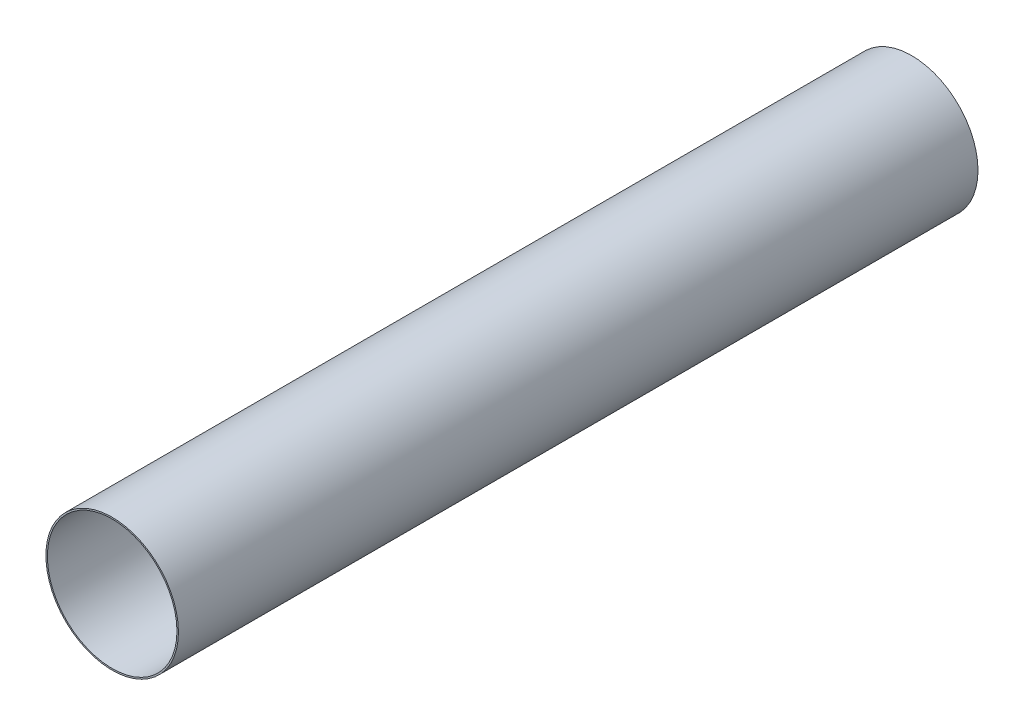
ISO-10303-21;
HEADER;
FILE_DESCRIPTION(('STEP AP214'),'2;1');
FILE_NAME('part.step','',(''),(''),'','','');
FILE_SCHEMA(('AUTOMOTIVE_DESIGN { 1 0 10303 214 1 1 1 1 }'));
ENDSEC;
DATA;
#1=APPLICATION_CONTEXT('core data for automotive mechanical design processes');
#2=APPLICATION_PROTOCOL_DEFINITION('international standard','automotive_design',2000,#1);
#3=PRODUCT_CONTEXT('',#1,'mechanical');
#4=PRODUCT('Part','Part','',(#3));
#5=PRODUCT_RELATED_PRODUCT_CATEGORY('part','',(#4));
#6=PRODUCT_DEFINITION_FORMATION('','',#4);
#7=PRODUCT_DEFINITION_CONTEXT('part definition',#1,'design');
#8=PRODUCT_DEFINITION('design','',#6,#7);
#9=PRODUCT_DEFINITION_SHAPE('','',#8);
#10=(LENGTH_UNIT() NAMED_UNIT(*) SI_UNIT(.MILLI.,.METRE.));
#11=(NAMED_UNIT(*) PLANE_ANGLE_UNIT() SI_UNIT($,.RADIAN.));
#12=(NAMED_UNIT(*) SI_UNIT($,.STERADIAN.) SOLID_ANGLE_UNIT());
#13=UNCERTAINTY_MEASURE_WITH_UNIT(LENGTH_MEASURE(1.E-05),#10,'distance_accuracy_value','');
#14=(GEOMETRIC_REPRESENTATION_CONTEXT(3) GLOBAL_UNCERTAINTY_ASSIGNED_CONTEXT((#13)) GLOBAL_UNIT_ASSIGNED_CONTEXT((#10,
#11,#12)) REPRESENTATION_CONTEXT('',''));
#15=CARTESIAN_POINT('',(0.,0.,0.));
#16=DIRECTION('',(0.,0.,1.));
#17=DIRECTION('',(1.,0.,0.));
#18=AXIS2_PLACEMENT_3D('',#15,#16,#17);
#19=CARTESIAN_POINT('',(0.,0.,612.775));
#20=DIRECTION('',(0.,0.,1.));
#21=DIRECTION('',(1.,0.,0.));
#22=AXIS2_PLACEMENT_3D('',#19,#20,#21);
#23=PLANE('',#22);
#24=CARTESIAN_POINT('',(0.,0.,612.775));
#25=DIRECTION('',(0.,0.,1.));
#26=DIRECTION('',(1.,0.,0.));
#27=AXIS2_PLACEMENT_3D('',#24,#25,#26);
#28=CIRCLE('',#27,50.8);
#29=CARTESIAN_POINT('',(50.8,0.,612.775));
#30=VERTEX_POINT('',#29);
#31=EDGE_CURVE('E10',#30,#30,#28,.T.);
#32=ORIENTED_EDGE('',*,*,#31,.T.);
#33=EDGE_LOOP('',(#32));
#34=FACE_BOUND('',#33,.T.);
#35=CARTESIAN_POINT('',(0.,0.,612.775));
#36=DIRECTION('',(0.,0.,1.));
#37=DIRECTION('',(1.,0.,0.));
#38=AXIS2_PLACEMENT_3D('',#35,#36,#37);
#39=CIRCLE('',#38,49.6697);
#40=CARTESIAN_POINT('',(49.6697,0.,612.775));
#41=VERTEX_POINT('',#40);
#42=EDGE_CURVE('E41',#41,#41,#39,.T.);
#43=ORIENTED_EDGE('',*,*,#42,.F.);
#44=EDGE_LOOP('',(#43));
#45=FACE_BOUND('',#44,.T.);
#46=ADVANCED_FACE('F30',(#34,#45),#23,.T.);
#47=CARTESIAN_POINT('',(0.,0.,0.));
#48=DIRECTION('',(0.,0.,1.));
#49=DIRECTION('',(1.,0.,0.));
#50=AXIS2_PLACEMENT_3D('',#47,#48,#49);
#51=PLANE('',#50);
#52=CARTESIAN_POINT('',(0.,0.,0.));
#53=DIRECTION('',(0.,0.,1.));
#54=DIRECTION('',(1.,0.,0.));
#55=AXIS2_PLACEMENT_3D('',#52,#53,#54);
#56=CIRCLE('',#55,50.8);
#57=CARTESIAN_POINT('',(50.8,0.,0.));
#58=VERTEX_POINT('',#57);
#59=EDGE_CURVE('E34',#58,#58,#56,.T.);
#60=ORIENTED_EDGE('',*,*,#59,.F.);
#61=EDGE_LOOP('',(#60));
#62=FACE_BOUND('',#61,.T.);
#63=CARTESIAN_POINT('',(0.,0.,0.));
#64=DIRECTION('',(0.,0.,1.));
#65=DIRECTION('',(1.,0.,0.));
#66=AXIS2_PLACEMENT_3D('',#63,#64,#65);
#67=CIRCLE('',#66,49.6697);
#68=CARTESIAN_POINT('',(49.6697,0.,0.));
#69=VERTEX_POINT('',#68);
#70=EDGE_CURVE('E43',#69,#69,#67,.T.);
#71=ORIENTED_EDGE('',*,*,#70,.T.);
#72=EDGE_LOOP('',(#71));
#73=FACE_BOUND('',#72,.T.);
#74=ADVANCED_FACE('F53',(#62,#73),#51,.F.);
#75=CARTESIAN_POINT('',(0.,0.,612.775));
#76=DIRECTION('',(0.,0.,-1.));
#77=DIRECTION('',(-1.,0.,0.));
#78=AXIS2_PLACEMENT_3D('',#75,#76,#77);
#79=CYLINDRICAL_SURFACE('',#78,50.8);
#80=ORIENTED_EDGE('',*,*,#31,.F.);
#81=EDGE_LOOP('',(#80));
#82=FACE_BOUND('',#81,.T.);
#83=ORIENTED_EDGE('',*,*,#59,.T.);
#84=EDGE_LOOP('',(#83));
#85=FACE_BOUND('',#84,.T.);
#86=ADVANCED_FACE('F32',(#82,#85),#79,.T.);
#87=CARTESIAN_POINT('',(0.,0.,612.775));
#88=DIRECTION('',(0.,0.,-1.));
#89=DIRECTION('',(-1.,0.,0.));
#90=AXIS2_PLACEMENT_3D('',#87,#88,#89);
#91=CYLINDRICAL_SURFACE('',#90,49.6697);
#92=ORIENTED_EDGE('',*,*,#42,.T.);
#93=EDGE_LOOP('',(#92));
#94=FACE_BOUND('',#93,.T.);
#95=ORIENTED_EDGE('',*,*,#70,.F.);
#96=EDGE_LOOP('',(#95));
#97=FACE_BOUND('',#96,.T.);
#98=ADVANCED_FACE('F49',(#94,#97),#91,.F.);
#99=CLOSED_SHELL('',(#46,#74,#86,#98));
#100=MANIFOLD_SOLID_BREP('B2',#99);
#101=ADVANCED_BREP_SHAPE_REPRESENTATION('',(#18,#100),#14);
#102=SHAPE_DEFINITION_REPRESENTATION(#9,#101);
ENDSEC;
END-ISO-10303-21;
